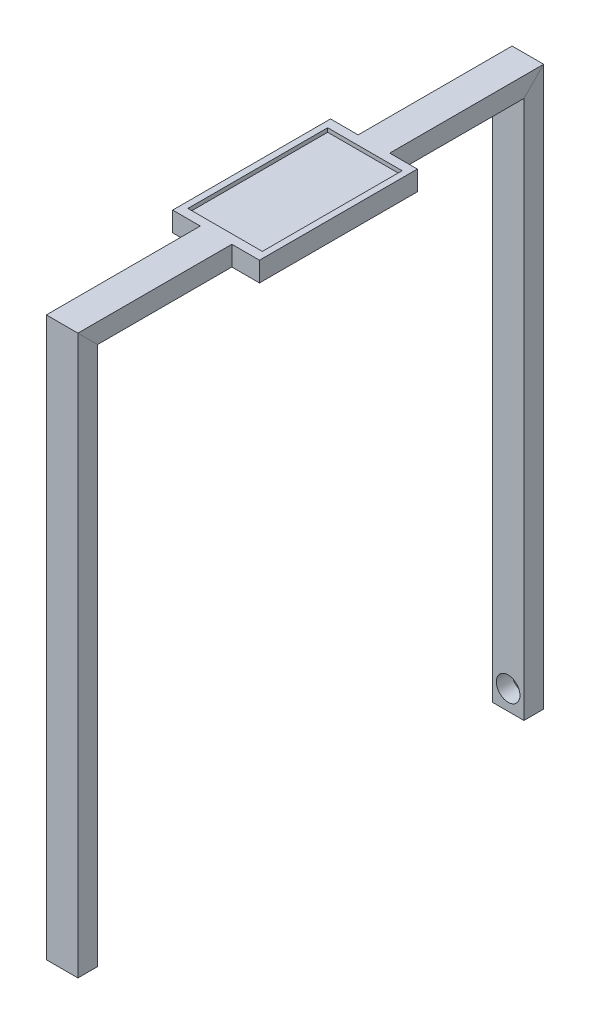
ISO-10303-21;
HEADER;
FILE_DESCRIPTION(('STEP AP214'),'2;1');
FILE_NAME('part.step','',(''),(''),'','','');
FILE_SCHEMA(('AUTOMOTIVE_DESIGN { 1 0 10303 214 1 1 1 1 }'));
ENDSEC;
DATA;
#1=APPLICATION_CONTEXT('core data for automotive mechanical design processes');
#2=APPLICATION_PROTOCOL_DEFINITION('international standard','automotive_design',2000,#1);
#3=PRODUCT_CONTEXT('',#1,'mechanical');
#4=PRODUCT('Part','Part','',(#3));
#5=PRODUCT_RELATED_PRODUCT_CATEGORY('part','',(#4));
#6=PRODUCT_DEFINITION_FORMATION('','',#4);
#7=PRODUCT_DEFINITION_CONTEXT('part definition',#1,'design');
#8=PRODUCT_DEFINITION('design','',#6,#7);
#9=PRODUCT_DEFINITION_SHAPE('','',#8);
#10=(LENGTH_UNIT() NAMED_UNIT(*) SI_UNIT(.MILLI.,.METRE.));
#11=(NAMED_UNIT(*) PLANE_ANGLE_UNIT() SI_UNIT($,.RADIAN.));
#12=(NAMED_UNIT(*) SI_UNIT($,.STERADIAN.) SOLID_ANGLE_UNIT());
#13=UNCERTAINTY_MEASURE_WITH_UNIT(LENGTH_MEASURE(1.E-05),#10,'distance_accuracy_value','');
#14=(GEOMETRIC_REPRESENTATION_CONTEXT(3) GLOBAL_UNCERTAINTY_ASSIGNED_CONTEXT((#13)) GLOBAL_UNIT_ASSIGNED_CONTEXT((#10,
#11,#12)) REPRESENTATION_CONTEXT('',''));
#15=CARTESIAN_POINT('',(0.,0.,0.));
#16=DIRECTION('',(0.,0.,1.));
#17=DIRECTION('',(1.,0.,0.));
#18=AXIS2_PLACEMENT_3D('',#15,#16,#17);
#19=CARTESIAN_POINT('',(-19.9999999999999,707.5,296.35));
#20=DIRECTION('',(-1.,0.,0.));
#21=DIRECTION('',(0.,-1.,0.));
#22=AXIS2_PLACEMENT_3D('',#19,#20,#21);
#23=PLANE('',#22);
#24=DIRECTION('',(0.,1.,0.));
#25=VECTOR('',#24,1.);
#26=CARTESIAN_POINT('',(-19.9999999999999,707.5,100.));
#27=LINE('',#26,#25);
#28=CARTESIAN_POINT('',(-20.,682.5,100.));
#29=VERTEX_POINT('',#28);
#30=CARTESIAN_POINT('',(-19.9999999999999,707.5,100.));
#31=VERTEX_POINT('',#30);
#32=EDGE_CURVE('E251',#29,#31,#27,.T.);
#33=ORIENTED_EDGE('',*,*,#32,.F.);
#34=DIRECTION('',(0.,0.,-1.));
#35=VECTOR('',#34,1.);
#36=CARTESIAN_POINT('',(-20.,682.5,296.35));
#37=LINE('',#36,#35);
#38=CARTESIAN_POINT('',(-20.,682.5,270.));
#39=VERTEX_POINT('',#38);
#40=EDGE_CURVE('E313',#39,#29,#37,.T.);
#41=ORIENTED_EDGE('',*,*,#40,.F.);
#42=DIRECTION('',(0.,-0.707106781186548,-0.707106781186548));
#43=VECTOR('',#42,1.);
#44=CARTESIAN_POINT('',(-20.,353.75,-58.75));
#45=LINE('',#44,#43);
#46=CARTESIAN_POINT('',(-19.9999999999999,707.5,295.));
#47=VERTEX_POINT('',#46);
#48=EDGE_CURVE('E267',#47,#39,#45,.T.);
#49=ORIENTED_EDGE('',*,*,#48,.F.);
#50=DIRECTION('',(0.,0.,-1.));
#51=VECTOR('',#50,1.);
#52=CARTESIAN_POINT('',(-19.9999999999999,707.5,296.35));
#53=LINE('',#52,#51);
#54=EDGE_CURVE('E61',#47,#31,#53,.T.);
#55=ORIENTED_EDGE('',*,*,#54,.T.);
#56=EDGE_LOOP('',(#33,#41,#49,#55));
#57=FACE_BOUND('',#56,.T.);
#58=ADVANCED_FACE('F38',(#57),#23,.T.);
#59=CARTESIAN_POINT('',(20.,707.5,296.35));
#60=DIRECTION('',(1.,0.,0.));
#61=DIRECTION('',(0.,1.,0.));
#62=AXIS2_PLACEMENT_3D('',#59,#60,#61);
#63=PLANE('',#62);
#64=DIRECTION('',(0.,-1.,0.));
#65=VECTOR('',#64,1.);
#66=CARTESIAN_POINT('',(20.,707.5,100.));
#67=LINE('',#66,#65);
#68=CARTESIAN_POINT('',(20.,707.5,100.));
#69=VERTEX_POINT('',#68);
#70=CARTESIAN_POINT('',(20.,682.5,100.));
#71=VERTEX_POINT('',#70);
#72=EDGE_CURVE('E11',#69,#71,#67,.T.);
#73=ORIENTED_EDGE('',*,*,#72,.F.);
#74=DIRECTION('',(0.,0.,-1.));
#75=VECTOR('',#74,1.);
#76=CARTESIAN_POINT('',(20.,707.5,296.35));
#77=LINE('',#76,#75);
#78=CARTESIAN_POINT('',(20.,707.5,295.));
#79=VERTEX_POINT('',#78);
#80=EDGE_CURVE('E321',#79,#69,#77,.T.);
#81=ORIENTED_EDGE('',*,*,#80,.F.);
#82=DIRECTION('',(0.,0.707106781186548,0.707106781186548));
#83=VECTOR('',#82,1.);
#84=CARTESIAN_POINT('',(20.0000000000001,353.75,-58.75));
#85=LINE('',#84,#83);
#86=CARTESIAN_POINT('',(20.,682.5,270.));
#87=VERTEX_POINT('',#86);
#88=EDGE_CURVE('E273',#87,#79,#85,.T.);
#89=ORIENTED_EDGE('',*,*,#88,.F.);
#90=DIRECTION('',(0.,0.,-1.));
#91=VECTOR('',#90,1.);
#92=CARTESIAN_POINT('',(20.,682.5,296.35));
#93=LINE('',#92,#91);
#94=EDGE_CURVE('E317',#87,#71,#93,.T.);
#95=ORIENTED_EDGE('',*,*,#94,.T.);
#96=EDGE_LOOP('',(#73,#81,#89,#95));
#97=FACE_BOUND('',#96,.T.);
#98=ADVANCED_FACE('F413',(#97),#63,.T.);
#99=CARTESIAN_POINT('',(0.,0.,0.));
#100=DIRECTION('',(0.,1.,0.));
#101=DIRECTION('',(0.,0.,1.));
#102=AXIS2_PLACEMENT_3D('',#99,#100,#101);
#103=PLANE('',#102);
#104=DIRECTION('',(0.,0.,1.));
#105=VECTOR('',#104,1.);
#106=CARTESIAN_POINT('',(20.,0.,-295.));
#107=LINE('',#106,#105);
#108=CARTESIAN_POINT('',(20.,0.,-295.));
#109=VERTEX_POINT('',#108);
#110=CARTESIAN_POINT('',(20.,0.,-270.));
#111=VERTEX_POINT('',#110);
#112=EDGE_CURVE('E331',#109,#111,#107,.T.);
#113=ORIENTED_EDGE('',*,*,#112,.T.);
#114=DIRECTION('',(-1.,0.,0.));
#115=VECTOR('',#114,1.);
#116=CARTESIAN_POINT('',(-20.,0.,-270.));
#117=LINE('',#116,#115);
#118=CARTESIAN_POINT('',(-20.,0.,-270.));
#119=VERTEX_POINT('',#118);
#120=EDGE_CURVE('E329',#111,#119,#117,.T.);
#121=ORIENTED_EDGE('',*,*,#120,.T.);
#122=DIRECTION('',(0.,0.,-1.));
#123=VECTOR('',#122,1.);
#124=CARTESIAN_POINT('',(-19.9999999999999,0.,-295.));
#125=LINE('',#124,#123);
#126=CARTESIAN_POINT('',(-19.9999999999999,0.,-295.));
#127=VERTEX_POINT('',#126);
#128=EDGE_CURVE('E327',#119,#127,#125,.T.);
#129=ORIENTED_EDGE('',*,*,#128,.T.);
#130=DIRECTION('',(1.,0.,0.));
#131=VECTOR('',#130,1.);
#132=CARTESIAN_POINT('',(-19.9999999999999,0.,-295.));
#133=LINE('',#132,#131);
#134=EDGE_CURVE('E263',#127,#109,#133,.T.);
#135=ORIENTED_EDGE('',*,*,#134,.T.);
#136=EDGE_LOOP('',(#113,#121,#129,#135));
#137=FACE_BOUND('',#136,.T.);
#138=ADVANCED_FACE('F40',(#137),#103,.F.);
#139=CARTESIAN_POINT('',(0.,0.,0.));
#140=DIRECTION('',(0.,-1.,0.));
#141=DIRECTION('',(0.,0.,-1.));
#142=AXIS2_PLACEMENT_3D('',#139,#140,#141);
#143=PLANE('',#142);
#144=DIRECTION('',(0.,0.,-1.));
#145=VECTOR('',#144,1.);
#146=CARTESIAN_POINT('',(20.,0.,295.));
#147=LINE('',#146,#145);
#148=CARTESIAN_POINT('',(20.,0.,295.));
#149=VERTEX_POINT('',#148);
#150=CARTESIAN_POINT('',(20.,0.,270.));
#151=VERTEX_POINT('',#150);
#152=EDGE_CURVE('E274',#149,#151,#147,.T.);
#153=ORIENTED_EDGE('',*,*,#152,.F.);
#154=DIRECTION('',(1.,0.,0.));
#155=VECTOR('',#154,1.);
#156=CARTESIAN_POINT('',(-19.9999999999999,0.,295.));
#157=LINE('',#156,#155);
#158=CARTESIAN_POINT('',(-19.9999999999999,0.,295.));
#159=VERTEX_POINT('',#158);
#160=EDGE_CURVE('E286',#159,#149,#157,.T.);
#161=ORIENTED_EDGE('',*,*,#160,.F.);
#162=DIRECTION('',(0.,0.,1.));
#163=VECTOR('',#162,1.);
#164=CARTESIAN_POINT('',(-19.9999999999999,0.,295.));
#165=LINE('',#164,#163);
#166=CARTESIAN_POINT('',(-20.,0.,270.));
#167=VERTEX_POINT('',#166);
#168=EDGE_CURVE('E289',#167,#159,#165,.T.);
#169=ORIENTED_EDGE('',*,*,#168,.F.);
#170=DIRECTION('',(-1.,0.,0.));
#171=VECTOR('',#170,1.);
#172=CARTESIAN_POINT('',(-20.,0.,270.));
#173=LINE('',#172,#171);
#174=EDGE_CURVE('E277',#151,#167,#173,.T.);
#175=ORIENTED_EDGE('',*,*,#174,.F.);
#176=EDGE_LOOP('',(#153,#161,#169,#175));
#177=FACE_BOUND('',#176,.T.);
#178=ADVANCED_FACE('F404',(#177),#143,.T.);
#179=CARTESIAN_POINT('',(20.,708.85,-295.));
#180=DIRECTION('',(1.,0.,0.));
#181=DIRECTION('',(0.,0.,-1.));
#182=AXIS2_PLACEMENT_3D('',#179,#180,#181);
#183=PLANE('',#182);
#184=DIRECTION('',(0.,0.707106781186548,-0.707106781186548));
#185=VECTOR('',#184,1.);
#186=CARTESIAN_POINT('',(20.0000000000001,411.825,0.675000000000037));
#187=LINE('',#186,#185);
#188=CARTESIAN_POINT('',(20.,682.5,-270.));
#189=VERTEX_POINT('',#188);
#190=CARTESIAN_POINT('',(20.,707.5,-295.));
#191=VERTEX_POINT('',#190);
#192=EDGE_CURVE('E309',#189,#191,#187,.T.);
#193=ORIENTED_EDGE('',*,*,#192,.F.);
#194=DIRECTION('',(0.,-1.,0.));
#195=VECTOR('',#194,1.);
#196=CARTESIAN_POINT('',(20.,708.85,-270.));
#197=LINE('',#196,#195);
#198=EDGE_CURVE('E339',#189,#111,#197,.T.);
#199=ORIENTED_EDGE('',*,*,#198,.T.);
#200=ORIENTED_EDGE('',*,*,#112,.F.);
#201=DIRECTION('',(0.,-1.,0.));
#202=VECTOR('',#201,1.);
#203=CARTESIAN_POINT('',(20.,708.85,-295.));
#204=LINE('',#203,#202);
#205=EDGE_CURVE('E342',#191,#109,#204,.T.);
#206=ORIENTED_EDGE('',*,*,#205,.F.);
#207=EDGE_LOOP('',(#193,#199,#200,#206));
#208=FACE_BOUND('',#207,.T.);
#209=ADVANCED_FACE('F367',(#208),#183,.T.);
#210=CARTESIAN_POINT('',(-20.,708.85,-270.));
#211=DIRECTION('',(0.,0.,1.));
#212=DIRECTION('',(1.,0.,0.));
#213=AXIS2_PLACEMENT_3D('',#210,#211,#212);
#214=PLANE('',#213);
#215=CARTESIAN_POINT('',(0.,25.,-270.));
#216=DIRECTION('',(0.,0.,1.));
#217=DIRECTION('',(1.,0.,0.));
#218=AXIS2_PLACEMENT_3D('',#215,#216,#217);
#219=CIRCLE('',#218,15.);
#220=CARTESIAN_POINT('',(15.,25.,-270.));
#221=VERTEX_POINT('',#220);
#222=EDGE_CURVE('E260',#221,#221,#219,.F.);
#223=ORIENTED_EDGE('',*,*,#222,.T.);
#224=EDGE_LOOP('',(#223));
#225=FACE_BOUND('',#224,.T.);
#226=DIRECTION('',(1.,0.,0.));
#227=VECTOR('',#226,1.);
#228=CARTESIAN_POINT('',(-20.,682.5,-270.));
#229=LINE('',#228,#227);
#230=CARTESIAN_POINT('',(-20.,682.5,-270.));
#231=VERTEX_POINT('',#230);
#232=EDGE_CURVE('E278',#231,#189,#229,.T.);
#233=ORIENTED_EDGE('',*,*,#232,.F.);
#234=DIRECTION('',(0.,-1.,0.));
#235=VECTOR('',#234,1.);
#236=CARTESIAN_POINT('',(-20.,708.85,-270.));
#237=LINE('',#236,#235);
#238=EDGE_CURVE('E336',#231,#119,#237,.T.);
#239=ORIENTED_EDGE('',*,*,#238,.T.);
#240=ORIENTED_EDGE('',*,*,#120,.F.);
#241=ORIENTED_EDGE('',*,*,#198,.F.);
#242=EDGE_LOOP('',(#233,#239,#240,#241));
#243=FACE_BOUND('',#242,.T.);
#244=ADVANCED_FACE('F374',(#225,#243),#214,.T.);
#245=CARTESIAN_POINT('',(-19.9999999999999,708.85,-295.));
#246=DIRECTION('',(-1.,0.,0.));
#247=DIRECTION('',(0.,0.,1.));
#248=AXIS2_PLACEMENT_3D('',#245,#246,#247);
#249=PLANE('',#248);
#250=DIRECTION('',(0.,-0.707106781186548,0.707106781186548));
#251=VECTOR('',#250,1.);
#252=CARTESIAN_POINT('',(-20.,411.825,0.675000000000037));
#253=LINE('',#252,#251);
#254=CARTESIAN_POINT('',(-19.9999999999999,707.5,-295.));
#255=VERTEX_POINT('',#254);
#256=EDGE_CURVE('E303',#255,#231,#253,.T.);
#257=ORIENTED_EDGE('',*,*,#256,.F.);
#258=DIRECTION('',(0.,-1.,0.));
#259=VECTOR('',#258,1.);
#260=CARTESIAN_POINT('',(-19.9999999999999,708.85,-295.));
#261=LINE('',#260,#259);
#262=EDGE_CURVE('E333',#255,#127,#261,.T.);
#263=ORIENTED_EDGE('',*,*,#262,.T.);
#264=ORIENTED_EDGE('',*,*,#128,.F.);
#265=ORIENTED_EDGE('',*,*,#238,.F.);
#266=EDGE_LOOP('',(#257,#263,#264,#265));
#267=FACE_BOUND('',#266,.T.);
#268=ADVANCED_FACE('F378',(#267),#249,.T.);
#269=CARTESIAN_POINT('',(-19.9999999999999,708.85,-295.));
#270=DIRECTION('',(0.,0.,-1.));
#271=DIRECTION('',(-1.,0.,0.));
#272=AXIS2_PLACEMENT_3D('',#269,#270,#271);
#273=PLANE('',#272);
#274=DIRECTION('',(-1.,0.,0.));
#275=VECTOR('',#274,1.);
#276=CARTESIAN_POINT('',(-19.9999999999999,707.5,-295.));
#277=LINE('',#276,#275);
#278=EDGE_CURVE('E306',#191,#255,#277,.T.);
#279=ORIENTED_EDGE('',*,*,#278,.F.);
#280=ORIENTED_EDGE('',*,*,#205,.T.);
#281=ORIENTED_EDGE('',*,*,#134,.F.);
#282=ORIENTED_EDGE('',*,*,#262,.F.);
#283=EDGE_LOOP('',(#279,#280,#281,#282));
#284=FACE_BOUND('',#283,.T.);
#285=ADVANCED_FACE('F363',(#284),#273,.T.);
#286=CARTESIAN_POINT('',(-19.9999999999999,707.5,296.35));
#287=DIRECTION('',(0.,1.,0.));
#288=DIRECTION('',(0.,0.,1.));
#289=AXIS2_PLACEMENT_3D('',#286,#287,#288);
#290=PLANE('',#289);
#291=DIRECTION('',(0.,0.,-1.));
#292=VECTOR('',#291,1.);
#293=CARTESIAN_POINT('',(47.1518177817841,707.5,88.5349713501726));
#294=LINE('',#293,#292);
#295=CARTESIAN_POINT('',(47.1518177817841,707.5,88.5349713501726));
#296=VERTEX_POINT('',#295);
#297=CARTESIAN_POINT('',(47.1518177817841,707.5,-88.5349713501726));
#298=VERTEX_POINT('',#297);
#299=EDGE_CURVE('E53',#296,#298,#294,.T.);
#300=ORIENTED_EDGE('',*,*,#299,.F.);
#301=DIRECTION('',(1.,0.,0.));
#302=VECTOR('',#301,1.);
#303=CARTESIAN_POINT('',(-47.1518177817841,707.5,88.5349713501726));
#304=LINE('',#303,#302);
#305=CARTESIAN_POINT('',(-47.1518177817841,707.5,88.5349713501726));
#306=VERTEX_POINT('',#305);
#307=EDGE_CURVE('E194',#306,#296,#304,.T.);
#308=ORIENTED_EDGE('',*,*,#307,.F.);
#309=DIRECTION('',(0.,0.,1.));
#310=VECTOR('',#309,1.);
#311=CARTESIAN_POINT('',(-47.1518177817841,707.5,88.5349713501726));
#312=LINE('',#311,#310);
#313=CARTESIAN_POINT('',(-47.1518177817841,707.5,-88.5349713501726));
#314=VERTEX_POINT('',#313);
#315=EDGE_CURVE('E197',#314,#306,#312,.T.);
#316=ORIENTED_EDGE('',*,*,#315,.F.);
#317=DIRECTION('',(-1.,0.,0.));
#318=VECTOR('',#317,1.);
#319=CARTESIAN_POINT('',(-47.1518177817841,707.5,-88.5349713501726));
#320=LINE('',#319,#318);
#321=EDGE_CURVE('E203',#298,#314,#320,.T.);
#322=ORIENTED_EDGE('',*,*,#321,.F.);
#323=EDGE_LOOP('',(#300,#308,#316,#322));
#324=FACE_BOUND('',#323,.T.);
#325=CARTESIAN_POINT('',(-19.9999999999999,707.5,-100.));
#326=VERTEX_POINT('',#325);
#327=EDGE_CURVE('E312',#326,#255,#53,.T.);
#328=ORIENTED_EDGE('',*,*,#327,.F.);
#329=DIRECTION('',(-1.,0.,0.));
#330=VECTOR('',#329,1.);
#331=CARTESIAN_POINT('',(-55.,707.5,-100.));
#332=LINE('',#331,#330);
#333=CARTESIAN_POINT('',(-55.,707.5,-100.));
#334=VERTEX_POINT('',#333);
#335=EDGE_CURVE('E230',#326,#334,#332,.T.);
#336=ORIENTED_EDGE('',*,*,#335,.T.);
#337=DIRECTION('',(0.,0.,1.));
#338=VECTOR('',#337,1.);
#339=CARTESIAN_POINT('',(-55.,707.5,100.));
#340=LINE('',#339,#338);
#341=CARTESIAN_POINT('',(-55.,707.5,100.));
#342=VERTEX_POINT('',#341);
#343=EDGE_CURVE('E233',#334,#342,#340,.T.);
#344=ORIENTED_EDGE('',*,*,#343,.T.);
#345=DIRECTION('',(1.,0.,0.));
#346=VECTOR('',#345,1.);
#347=CARTESIAN_POINT('',(-55.,707.5,100.));
#348=LINE('',#347,#346);
#349=EDGE_CURVE('E217',#342,#31,#348,.T.);
#350=ORIENTED_EDGE('',*,*,#349,.T.);
#351=ORIENTED_EDGE('',*,*,#54,.F.);
#352=DIRECTION('',(-1.,0.,0.));
#353=VECTOR('',#352,1.);
#354=CARTESIAN_POINT('',(-19.9999999999999,707.5,295.));
#355=LINE('',#354,#353);
#356=EDGE_CURVE('E270',#79,#47,#355,.T.);
#357=ORIENTED_EDGE('',*,*,#356,.F.);
#358=ORIENTED_EDGE('',*,*,#80,.T.);
#359=CARTESIAN_POINT('',(55.,707.5,100.));
#360=VERTEX_POINT('',#359);
#361=EDGE_CURVE('E236',#69,#360,#348,.T.);
#362=ORIENTED_EDGE('',*,*,#361,.T.);
#363=DIRECTION('',(0.,0.,-1.));
#364=VECTOR('',#363,1.);
#365=CARTESIAN_POINT('',(55.,707.5,100.));
#366=LINE('',#365,#364);
#367=CARTESIAN_POINT('',(55.,707.5,-100.));
#368=VERTEX_POINT('',#367);
#369=EDGE_CURVE('E209',#360,#368,#366,.T.);
#370=ORIENTED_EDGE('',*,*,#369,.T.);
#371=CARTESIAN_POINT('',(20.,707.5,-100.));
#372=VERTEX_POINT('',#371);
#373=EDGE_CURVE('E231',#368,#372,#332,.T.);
#374=ORIENTED_EDGE('',*,*,#373,.T.);
#375=EDGE_CURVE('E320',#372,#191,#77,.T.);
#376=ORIENTED_EDGE('',*,*,#375,.T.);
#377=ORIENTED_EDGE('',*,*,#278,.T.);
#378=EDGE_LOOP('',(#328,#336,#344,#350,#351,#357,#358,#362,#370,#374,#376,#377));
#379=FACE_BOUND('',#378,.T.);
#380=ADVANCED_FACE('F359',(#324,#379),#290,.T.);
#381=DIRECTION('',(0.,-1.,0.));
#382=VECTOR('',#381,1.);
#383=CARTESIAN_POINT('',(-19.9999999999999,707.5,-100.));
#384=LINE('',#383,#382);
#385=CARTESIAN_POINT('',(-20.,682.5,-100.));
#386=VERTEX_POINT('',#385);
#387=EDGE_CURVE('E242',#326,#386,#384,.T.);
#388=ORIENTED_EDGE('',*,*,#387,.F.);
#389=ORIENTED_EDGE('',*,*,#327,.T.);
#390=ORIENTED_EDGE('',*,*,#256,.T.);
#391=EDGE_CURVE('E311',#386,#231,#37,.T.);
#392=ORIENTED_EDGE('',*,*,#391,.F.);
#393=EDGE_LOOP('',(#388,#389,#390,#392));
#394=FACE_BOUND('',#393,.T.);
#395=ADVANCED_FACE('F381',(#394),#23,.T.);
#396=CARTESIAN_POINT('',(-20.,682.5,296.35));
#397=DIRECTION('',(0.,-1.,0.));
#398=DIRECTION('',(0.,0.,-1.));
#399=AXIS2_PLACEMENT_3D('',#396,#397,#398);
#400=PLANE('',#399);
#401=CARTESIAN_POINT('',(20.,682.5,-100.));
#402=VERTEX_POINT('',#401);
#403=EDGE_CURVE('E316',#402,#189,#93,.T.);
#404=ORIENTED_EDGE('',*,*,#403,.F.);
#405=DIRECTION('',(-1.,0.,0.));
#406=VECTOR('',#405,1.);
#407=CARTESIAN_POINT('',(-55.,682.5,-100.));
#408=LINE('',#407,#406);
#409=CARTESIAN_POINT('',(55.,682.5,-100.));
#410=VERTEX_POINT('',#409);
#411=EDGE_CURVE('E218',#410,#402,#408,.T.);
#412=ORIENTED_EDGE('',*,*,#411,.F.);
#413=DIRECTION('',(0.,0.,-1.));
#414=VECTOR('',#413,1.);
#415=CARTESIAN_POINT('',(55.,682.5,100.));
#416=LINE('',#415,#414);
#417=CARTESIAN_POINT('',(55.,682.5,100.));
#418=VERTEX_POINT('',#417);
#419=EDGE_CURVE('E213',#418,#410,#416,.T.);
#420=ORIENTED_EDGE('',*,*,#419,.F.);
#421=DIRECTION('',(1.,0.,0.));
#422=VECTOR('',#421,1.);
#423=CARTESIAN_POINT('',(-55.,682.5,100.));
#424=LINE('',#423,#422);
#425=EDGE_CURVE('E223',#71,#418,#424,.T.);
#426=ORIENTED_EDGE('',*,*,#425,.F.);
#427=ORIENTED_EDGE('',*,*,#94,.F.);
#428=DIRECTION('',(1.,0.,0.));
#429=VECTOR('',#428,1.);
#430=CARTESIAN_POINT('',(-20.,682.5,270.));
#431=LINE('',#430,#429);
#432=EDGE_CURVE('E264',#39,#87,#431,.T.);
#433=ORIENTED_EDGE('',*,*,#432,.F.);
#434=ORIENTED_EDGE('',*,*,#40,.T.);
#435=CARTESIAN_POINT('',(-55.,682.5,100.));
#436=VERTEX_POINT('',#435);
#437=EDGE_CURVE('E224',#436,#29,#424,.T.);
#438=ORIENTED_EDGE('',*,*,#437,.F.);
#439=DIRECTION('',(0.,0.,1.));
#440=VECTOR('',#439,1.);
#441=CARTESIAN_POINT('',(-55.,682.5,100.));
#442=LINE('',#441,#440);
#443=CARTESIAN_POINT('',(-55.,682.5,-100.));
#444=VERTEX_POINT('',#443);
#445=EDGE_CURVE('E220',#444,#436,#442,.T.);
#446=ORIENTED_EDGE('',*,*,#445,.F.);
#447=EDGE_CURVE('E216',#386,#444,#408,.T.);
#448=ORIENTED_EDGE('',*,*,#447,.F.);
#449=ORIENTED_EDGE('',*,*,#391,.T.);
#450=ORIENTED_EDGE('',*,*,#232,.T.);
#451=EDGE_LOOP('',(#404,#412,#420,#426,#427,#433,#434,#438,#446,#448,#449,#450));
#452=FACE_BOUND('',#451,.T.);
#453=ADVANCED_FACE('F416',(#452),#400,.T.);
#454=DIRECTION('',(0.,1.,0.));
#455=VECTOR('',#454,1.);
#456=CARTESIAN_POINT('',(20.,707.5,-100.));
#457=LINE('',#456,#455);
#458=EDGE_CURVE('E46',#402,#372,#457,.T.);
#459=ORIENTED_EDGE('',*,*,#458,.F.);
#460=ORIENTED_EDGE('',*,*,#403,.T.);
#461=ORIENTED_EDGE('',*,*,#192,.T.);
#462=ORIENTED_EDGE('',*,*,#375,.F.);
#463=EDGE_LOOP('',(#459,#460,#461,#462));
#464=FACE_BOUND('',#463,.T.);
#465=ADVANCED_FACE('F355',(#464),#63,.T.);
#466=CARTESIAN_POINT('',(-19.9999999999999,0.,295.));
#467=DIRECTION('',(0.,0.,1.));
#468=DIRECTION('',(1.,0.,0.));
#469=AXIS2_PLACEMENT_3D('',#466,#467,#468);
#470=PLANE('',#469);
#471=DIRECTION('',(0.,1.,0.));
#472=VECTOR('',#471,1.);
#473=CARTESIAN_POINT('',(20.,0.,295.));
#474=LINE('',#473,#472);
#475=EDGE_CURVE('E283',#149,#79,#474,.T.);
#476=ORIENTED_EDGE('',*,*,#475,.T.);
#477=ORIENTED_EDGE('',*,*,#356,.T.);
#478=DIRECTION('',(0.,1.,0.));
#479=VECTOR('',#478,1.);
#480=CARTESIAN_POINT('',(-19.9999999999999,0.,295.));
#481=LINE('',#480,#479);
#482=EDGE_CURVE('E292',#159,#47,#481,.T.);
#483=ORIENTED_EDGE('',*,*,#482,.F.);
#484=ORIENTED_EDGE('',*,*,#160,.T.);
#485=EDGE_LOOP('',(#476,#477,#483,#484));
#486=FACE_BOUND('',#485,.T.);
#487=ADVANCED_FACE('F398',(#486),#470,.T.);
#488=CARTESIAN_POINT('',(-19.9999999999999,0.,295.));
#489=DIRECTION('',(-1.,0.,0.));
#490=DIRECTION('',(0.,0.,1.));
#491=AXIS2_PLACEMENT_3D('',#488,#489,#490);
#492=PLANE('',#491);
#493=ORIENTED_EDGE('',*,*,#482,.T.);
#494=ORIENTED_EDGE('',*,*,#48,.T.);
#495=DIRECTION('',(0.,1.,0.));
#496=VECTOR('',#495,1.);
#497=CARTESIAN_POINT('',(-20.,0.,270.));
#498=LINE('',#497,#496);
#499=EDGE_CURVE('E282',#167,#39,#498,.T.);
#500=ORIENTED_EDGE('',*,*,#499,.F.);
#501=ORIENTED_EDGE('',*,*,#168,.T.);
#502=EDGE_LOOP('',(#493,#494,#500,#501));
#503=FACE_BOUND('',#502,.T.);
#504=ADVANCED_FACE('F401',(#503),#492,.T.);
#505=CARTESIAN_POINT('',(-20.,0.,270.));
#506=DIRECTION('',(0.,0.,-1.));
#507=DIRECTION('',(-1.,0.,0.));
#508=AXIS2_PLACEMENT_3D('',#505,#506,#507);
#509=PLANE('',#508);
#510=CARTESIAN_POINT('',(0.,25.,270.));
#511=DIRECTION('',(0.,0.,-1.));
#512=DIRECTION('',(-1.,0.,0.));
#513=AXIS2_PLACEMENT_3D('',#510,#511,#512);
#514=CIRCLE('',#513,15.);
#515=CARTESIAN_POINT('',(-15.,25.,270.));
#516=VERTEX_POINT('',#515);
#517=EDGE_CURVE('E259',#516,#516,#514,.F.);
#518=ORIENTED_EDGE('',*,*,#517,.T.);
#519=EDGE_LOOP('',(#518));
#520=FACE_BOUND('',#519,.T.);
#521=ORIENTED_EDGE('',*,*,#499,.T.);
#522=ORIENTED_EDGE('',*,*,#432,.T.);
#523=DIRECTION('',(0.,1.,0.));
#524=VECTOR('',#523,1.);
#525=CARTESIAN_POINT('',(20.,0.,270.));
#526=LINE('',#525,#524);
#527=EDGE_CURVE('E279',#151,#87,#526,.T.);
#528=ORIENTED_EDGE('',*,*,#527,.F.);
#529=ORIENTED_EDGE('',*,*,#174,.T.);
#530=EDGE_LOOP('',(#521,#522,#528,#529));
#531=FACE_BOUND('',#530,.T.);
#532=ADVANCED_FACE('F407',(#520,#531),#509,.T.);
#533=CARTESIAN_POINT('',(20.,0.,295.));
#534=DIRECTION('',(1.,0.,0.));
#535=DIRECTION('',(0.,0.,-1.));
#536=AXIS2_PLACEMENT_3D('',#533,#534,#535);
#537=PLANE('',#536);
#538=ORIENTED_EDGE('',*,*,#527,.T.);
#539=ORIENTED_EDGE('',*,*,#88,.T.);
#540=ORIENTED_EDGE('',*,*,#475,.F.);
#541=ORIENTED_EDGE('',*,*,#152,.T.);
#542=EDGE_LOOP('',(#538,#539,#540,#541));
#543=FACE_BOUND('',#542,.T.);
#544=ADVANCED_FACE('F409',(#543),#537,.T.);
#545=CARTESIAN_POINT('',(0.,25.,290.));
#546=DIRECTION('',(0.,0.,1.));
#547=DIRECTION('',(1.,0.,0.));
#548=AXIS2_PLACEMENT_3D('',#545,#546,#547);
#549=PLANE('',#548);
#550=CARTESIAN_POINT('',(0.,25.,290.));
#551=DIRECTION('',(0.,0.,1.));
#552=DIRECTION('',(1.,0.,0.));
#553=AXIS2_PLACEMENT_3D('',#550,#551,#552);
#554=CIRCLE('',#553,15.);
#555=CARTESIAN_POINT('',(15.,25.,290.));
#556=VERTEX_POINT('',#555);
#557=EDGE_CURVE('E256',#556,#556,#554,.T.);
#558=ORIENTED_EDGE('',*,*,#557,.F.);
#559=EDGE_LOOP('',(#558));
#560=FACE_BOUND('',#559,.T.);
#561=ADVANCED_FACE('F454',(#560),#549,.F.);
#562=CARTESIAN_POINT('',(0.,25.,290.));
#563=DIRECTION('',(0.,0.,-1.));
#564=DIRECTION('',(-1.,0.,0.));
#565=AXIS2_PLACEMENT_3D('',#562,#563,#564);
#566=CYLINDRICAL_SURFACE('',#565,15.);
#567=ORIENTED_EDGE('',*,*,#517,.F.);
#568=EDGE_LOOP('',(#567));
#569=FACE_BOUND('',#568,.T.);
#570=ORIENTED_EDGE('',*,*,#557,.T.);
#571=EDGE_LOOP('',(#570));
#572=FACE_BOUND('',#571,.T.);
#573=ADVANCED_FACE('F458',(#569,#572),#566,.F.);
#574=ORIENTED_EDGE('',*,*,#222,.F.);
#575=EDGE_LOOP('',(#574));
#576=FACE_BOUND('',#575,.T.);
#577=CARTESIAN_POINT('',(0.,25.,-290.));
#578=DIRECTION('',(0.,0.,1.));
#579=DIRECTION('',(1.,0.,0.));
#580=AXIS2_PLACEMENT_3D('',#577,#578,#579);
#581=CIRCLE('',#580,15.);
#582=CARTESIAN_POINT('',(15.,25.,-290.));
#583=VERTEX_POINT('',#582);
#584=EDGE_CURVE('E253',#583,#583,#581,.T.);
#585=ORIENTED_EDGE('',*,*,#584,.F.);
#586=EDGE_LOOP('',(#585));
#587=FACE_BOUND('',#586,.T.);
#588=ADVANCED_FACE('F465',(#576,#587),#566,.F.);
#589=CARTESIAN_POINT('',(0.,25.,-290.));
#590=DIRECTION('',(0.,0.,1.));
#591=DIRECTION('',(1.,0.,0.));
#592=AXIS2_PLACEMENT_3D('',#589,#590,#591);
#593=PLANE('',#592);
#594=ORIENTED_EDGE('',*,*,#584,.T.);
#595=EDGE_LOOP('',(#594));
#596=FACE_BOUND('',#595,.T.);
#597=ADVANCED_FACE('F471',(#596),#593,.T.);
#598=CARTESIAN_POINT('',(55.,682.5,100.));
#599=DIRECTION('',(1.,0.,0.));
#600=DIRECTION('',(0.,0.,-1.));
#601=AXIS2_PLACEMENT_3D('',#598,#599,#600);
#602=PLANE('',#601);
#603=ORIENTED_EDGE('',*,*,#369,.F.);
#604=DIRECTION('',(0.,1.,0.));
#605=VECTOR('',#604,1.);
#606=CARTESIAN_POINT('',(55.,682.5,100.));
#607=LINE('',#606,#605);
#608=EDGE_CURVE('E239',#418,#360,#607,.T.);
#609=ORIENTED_EDGE('',*,*,#608,.F.);
#610=ORIENTED_EDGE('',*,*,#419,.T.);
#611=DIRECTION('',(0.,1.,0.));
#612=VECTOR('',#611,1.);
#613=CARTESIAN_POINT('',(55.,682.5,-100.));
#614=LINE('',#613,#612);
#615=EDGE_CURVE('E227',#410,#368,#614,.T.);
#616=ORIENTED_EDGE('',*,*,#615,.T.);
#617=EDGE_LOOP('',(#603,#609,#610,#616));
#618=FACE_BOUND('',#617,.T.);
#619=ADVANCED_FACE('F424',(#618),#602,.T.);
#620=CARTESIAN_POINT('',(-55.,682.5,-100.));
#621=DIRECTION('',(0.,0.,-1.));
#622=DIRECTION('',(-1.,0.,0.));
#623=AXIS2_PLACEMENT_3D('',#620,#621,#622);
#624=PLANE('',#623);
#625=ORIENTED_EDGE('',*,*,#411,.T.);
#626=ORIENTED_EDGE('',*,*,#458,.T.);
#627=ORIENTED_EDGE('',*,*,#373,.F.);
#628=ORIENTED_EDGE('',*,*,#615,.F.);
#629=EDGE_LOOP('',(#625,#626,#627,#628));
#630=FACE_BOUND('',#629,.T.);
#631=ADVANCED_FACE('F351',(#630),#624,.T.);
#632=CARTESIAN_POINT('',(-55.,682.5,100.));
#633=DIRECTION('',(0.,0.,1.));
#634=DIRECTION('',(1.,0.,0.));
#635=AXIS2_PLACEMENT_3D('',#632,#633,#634);
#636=PLANE('',#635);
#637=ORIENTED_EDGE('',*,*,#361,.F.);
#638=ORIENTED_EDGE('',*,*,#72,.T.);
#639=ORIENTED_EDGE('',*,*,#425,.T.);
#640=ORIENTED_EDGE('',*,*,#608,.T.);
#641=EDGE_LOOP('',(#637,#638,#639,#640));
#642=FACE_BOUND('',#641,.T.);
#643=ADVANCED_FACE('F421',(#642),#636,.T.);
#644=ORIENTED_EDGE('',*,*,#437,.T.);
#645=ORIENTED_EDGE('',*,*,#32,.T.);
#646=ORIENTED_EDGE('',*,*,#349,.F.);
#647=DIRECTION('',(0.,1.,0.));
#648=VECTOR('',#647,1.);
#649=CARTESIAN_POINT('',(-55.,682.5,100.));
#650=LINE('',#649,#648);
#651=EDGE_CURVE('E243',#436,#342,#650,.T.);
#652=ORIENTED_EDGE('',*,*,#651,.F.);
#653=EDGE_LOOP('',(#644,#645,#646,#652));
#654=FACE_BOUND('',#653,.T.);
#655=ADVANCED_FACE('F394',(#654),#636,.T.);
#656=ORIENTED_EDGE('',*,*,#335,.F.);
#657=ORIENTED_EDGE('',*,*,#387,.T.);
#658=ORIENTED_EDGE('',*,*,#447,.T.);
#659=DIRECTION('',(0.,1.,0.));
#660=VECTOR('',#659,1.);
#661=CARTESIAN_POINT('',(-55.,682.5,-100.));
#662=LINE('',#661,#660);
#663=EDGE_CURVE('E245',#444,#334,#662,.T.);
#664=ORIENTED_EDGE('',*,*,#663,.T.);
#665=EDGE_LOOP('',(#656,#657,#658,#664));
#666=FACE_BOUND('',#665,.T.);
#667=ADVANCED_FACE('F387',(#666),#624,.T.);
#668=CARTESIAN_POINT('',(-55.,682.5,100.));
#669=DIRECTION('',(-1.,0.,0.));
#670=DIRECTION('',(0.,0.,1.));
#671=AXIS2_PLACEMENT_3D('',#668,#669,#670);
#672=PLANE('',#671);
#673=ORIENTED_EDGE('',*,*,#343,.F.);
#674=ORIENTED_EDGE('',*,*,#663,.F.);
#675=ORIENTED_EDGE('',*,*,#445,.T.);
#676=ORIENTED_EDGE('',*,*,#651,.T.);
#677=EDGE_LOOP('',(#673,#674,#675,#676));
#678=FACE_BOUND('',#677,.T.);
#679=ADVANCED_FACE('F391',(#678),#672,.T.);
#680=CARTESIAN_POINT('',(47.1518177817841,702.5,88.5349713501726));
#681=DIRECTION('',(1.,0.,0.));
#682=DIRECTION('',(0.,0.,-1.));
#683=AXIS2_PLACEMENT_3D('',#680,#681,#682);
#684=PLANE('',#683);
#685=ORIENTED_EDGE('',*,*,#299,.T.);
#686=DIRECTION('',(0.,1.,0.));
#687=VECTOR('',#686,1.);
#688=CARTESIAN_POINT('',(47.1518177817841,702.5,-88.5349713501726));
#689=LINE('',#688,#687);
#690=CARTESIAN_POINT('',(47.1518177817841,702.5,-88.5349713501726));
#691=VERTEX_POINT('',#690);
#692=EDGE_CURVE('E172',#691,#298,#689,.T.);
#693=ORIENTED_EDGE('',*,*,#692,.F.);
#694=DIRECTION('',(0.,0.,-1.));
#695=VECTOR('',#694,1.);
#696=CARTESIAN_POINT('',(47.1518177817841,702.5,88.5349713501726));
#697=LINE('',#696,#695);
#698=CARTESIAN_POINT('',(47.1518177817841,702.5,88.5349713501726));
#699=VERTEX_POINT('',#698);
#700=EDGE_CURVE('E176',#699,#691,#697,.T.);
#701=ORIENTED_EDGE('',*,*,#700,.F.);
#702=DIRECTION('',(0.,1.,0.));
#703=VECTOR('',#702,1.);
#704=CARTESIAN_POINT('',(47.1518177817841,702.5,88.5349713501726));
#705=LINE('',#704,#703);
#706=EDGE_CURVE('E207',#699,#296,#705,.T.);
#707=ORIENTED_EDGE('',*,*,#706,.T.);
#708=EDGE_LOOP('',(#685,#693,#701,#707));
#709=FACE_BOUND('',#708,.T.);
#710=ADVANCED_FACE('F174',(#709),#684,.F.);
#711=CARTESIAN_POINT('',(-47.1518177817841,702.5,88.5349713501726));
#712=DIRECTION('',(0.,0.,1.));
#713=DIRECTION('',(1.,0.,0.));
#714=AXIS2_PLACEMENT_3D('',#711,#712,#713);
#715=PLANE('',#714);
#716=ORIENTED_EDGE('',*,*,#307,.T.);
#717=ORIENTED_EDGE('',*,*,#706,.F.);
#718=DIRECTION('',(1.,0.,0.));
#719=VECTOR('',#718,1.);
#720=CARTESIAN_POINT('',(-47.1518177817841,702.5,88.5349713501726));
#721=LINE('',#720,#719);
#722=CARTESIAN_POINT('',(-47.1518177817841,702.5,88.5349713501726));
#723=VERTEX_POINT('',#722);
#724=EDGE_CURVE('E182',#723,#699,#721,.T.);
#725=ORIENTED_EDGE('',*,*,#724,.F.);
#726=DIRECTION('',(0.,1.,0.));
#727=VECTOR('',#726,1.);
#728=CARTESIAN_POINT('',(-47.1518177817841,702.5,88.5349713501726));
#729=LINE('',#728,#727);
#730=EDGE_CURVE('E210',#723,#306,#729,.T.);
#731=ORIENTED_EDGE('',*,*,#730,.T.);
#732=EDGE_LOOP('',(#716,#717,#725,#731));
#733=FACE_BOUND('',#732,.T.);
#734=ADVANCED_FACE('F599',(#733),#715,.F.);
#735=CARTESIAN_POINT('',(-47.1518177817841,702.5,88.5349713501726));
#736=DIRECTION('',(-1.,0.,0.));
#737=DIRECTION('',(0.,0.,1.));
#738=AXIS2_PLACEMENT_3D('',#735,#736,#737);
#739=PLANE('',#738);
#740=ORIENTED_EDGE('',*,*,#315,.T.);
#741=ORIENTED_EDGE('',*,*,#730,.F.);
#742=DIRECTION('',(0.,0.,1.));
#743=VECTOR('',#742,1.);
#744=CARTESIAN_POINT('',(-47.1518177817841,702.5,88.5349713501726));
#745=LINE('',#744,#743);
#746=CARTESIAN_POINT('',(-47.1518177817841,702.5,-88.5349713501726));
#747=VERTEX_POINT('',#746);
#748=EDGE_CURVE('E190',#747,#723,#745,.T.);
#749=ORIENTED_EDGE('',*,*,#748,.F.);
#750=DIRECTION('',(0.,1.,0.));
#751=VECTOR('',#750,1.);
#752=CARTESIAN_POINT('',(-47.1518177817841,702.5,-88.5349713501726));
#753=LINE('',#752,#751);
#754=EDGE_CURVE('E181',#747,#314,#753,.T.);
#755=ORIENTED_EDGE('',*,*,#754,.T.);
#756=EDGE_LOOP('',(#740,#741,#749,#755));
#757=FACE_BOUND('',#756,.T.);
#758=ADVANCED_FACE('F607',(#757),#739,.F.);
#759=CARTESIAN_POINT('',(-47.1518177817841,702.5,-88.5349713501726));
#760=DIRECTION('',(0.,0.,-1.));
#761=DIRECTION('',(-1.,0.,0.));
#762=AXIS2_PLACEMENT_3D('',#759,#760,#761);
#763=PLANE('',#762);
#764=ORIENTED_EDGE('',*,*,#321,.T.);
#765=ORIENTED_EDGE('',*,*,#754,.F.);
#766=DIRECTION('',(-1.,0.,0.));
#767=VECTOR('',#766,1.);
#768=CARTESIAN_POINT('',(-47.1518177817841,702.5,-88.5349713501726));
#769=LINE('',#768,#767);
#770=EDGE_CURVE('E185',#691,#747,#769,.T.);
#771=ORIENTED_EDGE('',*,*,#770,.F.);
#772=ORIENTED_EDGE('',*,*,#692,.T.);
#773=EDGE_LOOP('',(#764,#765,#771,#772));
#774=FACE_BOUND('',#773,.T.);
#775=ADVANCED_FACE('F186',(#774),#763,.F.);
#776=CARTESIAN_POINT('',(0.,702.5,0.));
#777=DIRECTION('',(0.,-1.,0.));
#778=DIRECTION('',(0.,0.,-1.));
#779=AXIS2_PLACEMENT_3D('',#776,#777,#778);
#780=PLANE('',#779);
#781=ORIENTED_EDGE('',*,*,#700,.T.);
#782=ORIENTED_EDGE('',*,*,#770,.T.);
#783=ORIENTED_EDGE('',*,*,#748,.T.);
#784=ORIENTED_EDGE('',*,*,#724,.T.);
#785=EDGE_LOOP('',(#781,#782,#783,#784));
#786=FACE_BOUND('',#785,.T.);
#787=ADVANCED_FACE('F192',(#786),#780,.F.);
#788=CLOSED_SHELL('',(#58,#98,#138,#178,#209,#244,#268,#285,#380,#395,#453,#465,#487,#504,#532,
#544,#561,#573,#588,#597,#619,#631,#643,#655,#667,#679,#710,#734,#758,#775,#787));
#789=MANIFOLD_SOLID_BREP('B2',#788);
#790=ADVANCED_BREP_SHAPE_REPRESENTATION('',(#18,#789),#14);
#791=SHAPE_DEFINITION_REPRESENTATION(#9,#790);
ENDSEC;
END-ISO-10303-21;
